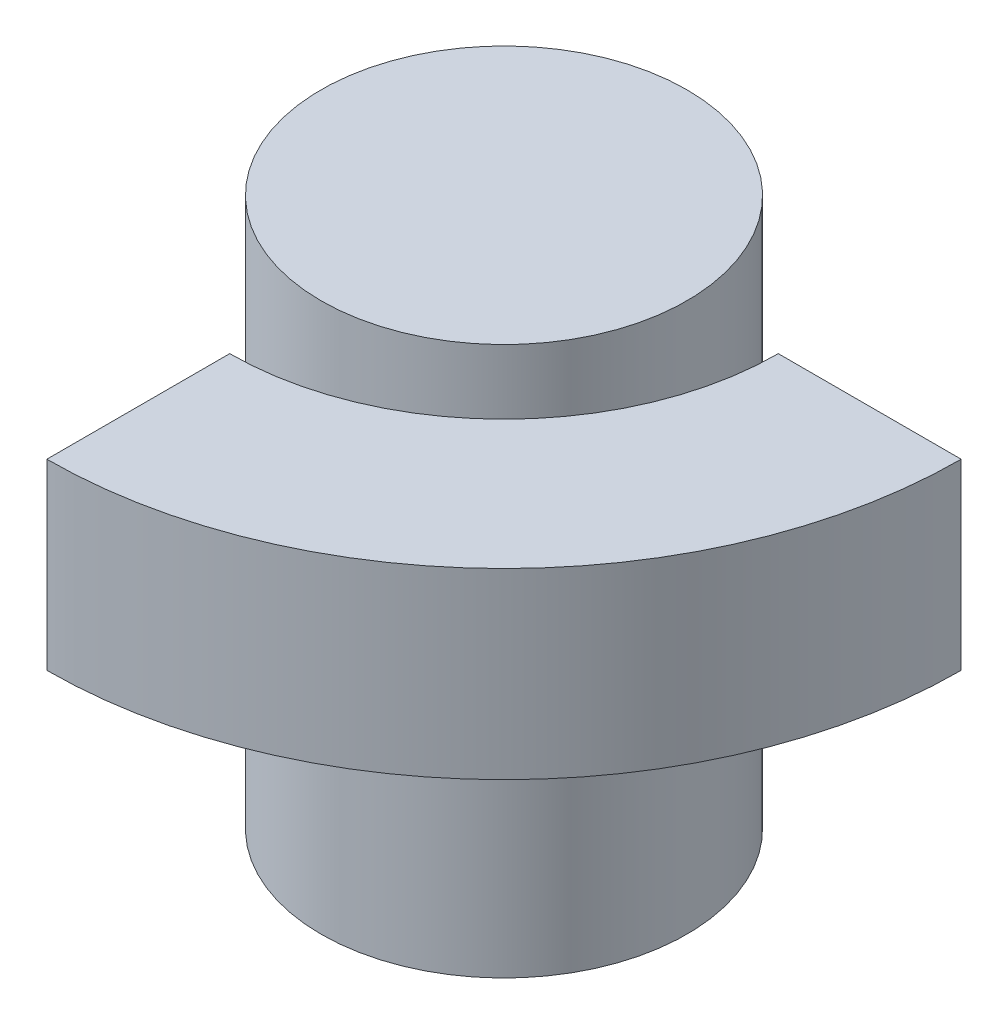
ISO-10303-21;
HEADER;
FILE_DESCRIPTION(('STEP AP214'),'2;1');
FILE_NAME('part.step','',(''),(''),'','','');
FILE_SCHEMA(('AUTOMOTIVE_DESIGN { 1 0 10303 214 1 1 1 1 }'));
ENDSEC;
DATA;
#1=APPLICATION_CONTEXT('core data for automotive mechanical design processes');
#2=APPLICATION_PROTOCOL_DEFINITION('international standard','automotive_design',2000,#1);
#3=PRODUCT_CONTEXT('',#1,'mechanical');
#4=PRODUCT('Part','Part','',(#3));
#5=PRODUCT_RELATED_PRODUCT_CATEGORY('part','',(#4));
#6=PRODUCT_DEFINITION_FORMATION('','',#4);
#7=PRODUCT_DEFINITION_CONTEXT('part definition',#1,'design');
#8=PRODUCT_DEFINITION('design','',#6,#7);
#9=PRODUCT_DEFINITION_SHAPE('','',#8);
#10=(LENGTH_UNIT() NAMED_UNIT(*) SI_UNIT(.MILLI.,.METRE.));
#11=(NAMED_UNIT(*) PLANE_ANGLE_UNIT() SI_UNIT($,.RADIAN.));
#12=(NAMED_UNIT(*) SI_UNIT($,.STERADIAN.) SOLID_ANGLE_UNIT());
#13=UNCERTAINTY_MEASURE_WITH_UNIT(LENGTH_MEASURE(1.E-05),#10,'distance_accuracy_value','');
#14=(GEOMETRIC_REPRESENTATION_CONTEXT(3) GLOBAL_UNCERTAINTY_ASSIGNED_CONTEXT((#13)) GLOBAL_UNIT_ASSIGNED_CONTEXT((#10,
#11,#12)) REPRESENTATION_CONTEXT('',''));
#15=CARTESIAN_POINT('',(0.,0.,0.));
#16=DIRECTION('',(0.,0.,1.));
#17=DIRECTION('',(1.,0.,0.));
#18=AXIS2_PLACEMENT_3D('',#15,#16,#17);
#19=CARTESIAN_POINT('',(20.,-15.,0.));
#20=DIRECTION('',(0.,1.,0.));
#21=DIRECTION('',(0.,0.,1.));
#22=AXIS2_PLACEMENT_3D('',#19,#20,#21);
#23=CYLINDRICAL_SURFACE('',#22,15.);
#24=CARTESIAN_POINT('',(20.,15.,0.));
#25=DIRECTION('',(0.,1.,0.));
#26=DIRECTION('',(0.,0.,1.));
#27=AXIS2_PLACEMENT_3D('',#24,#25,#26);
#28=CIRCLE('',#27,15.);
#29=CARTESIAN_POINT('',(20.,15.,15.));
#30=VERTEX_POINT('',#29);
#31=CARTESIAN_POINT('',(35.,15.,0.));
#32=VERTEX_POINT('',#31);
#33=EDGE_CURVE('E12',#30,#32,#28,.T.);
#34=ORIENTED_EDGE('',*,*,#33,.T.);
#35=DIRECTION('',(0.,-1.,0.));
#36=VECTOR('',#35,1.);
#37=CARTESIAN_POINT('',(35.,5.,0.));
#38=LINE('',#37,#36);
#39=CARTESIAN_POINT('',(35.,5.,0.));
#40=VERTEX_POINT('',#39);
#41=EDGE_CURVE('E101',#32,#40,#38,.T.);
#42=ORIENTED_EDGE('',*,*,#41,.T.);
#43=CARTESIAN_POINT('',(20.,5.,0.));
#44=DIRECTION('',(0.,1.,0.));
#45=DIRECTION('',(0.,0.,1.));
#46=AXIS2_PLACEMENT_3D('',#43,#44,#45);
#47=CIRCLE('',#46,15.);
#48=CARTESIAN_POINT('',(20.,5.,15.));
#49=VERTEX_POINT('',#48);
#50=EDGE_CURVE('E83',#49,#40,#47,.T.);
#51=ORIENTED_EDGE('',*,*,#50,.F.);
#52=DIRECTION('',(0.,-1.,0.));
#53=VECTOR('',#52,1.);
#54=CARTESIAN_POINT('',(20.,5.,15.));
#55=LINE('',#54,#53);
#56=EDGE_CURVE('E109',#30,#49,#55,.T.);
#57=ORIENTED_EDGE('',*,*,#56,.F.);
#58=EDGE_LOOP('',(#34,#42,#51,#57));
#59=FACE_BOUND('',#58,.T.);
#60=ADVANCED_FACE('F43',(#59),#23,.F.);
#61=CARTESIAN_POINT('',(20.,15.,15.));
#62=DIRECTION('',(0.,-1.,0.));
#63=DIRECTION('',(0.,0.,-1.));
#64=AXIS2_PLACEMENT_3D('',#61,#62,#63);
#65=PLANE('',#64);
#66=CARTESIAN_POINT('',(20.,15.,0.));
#67=DIRECTION('',(0.,1.,0.));
#68=DIRECTION('',(0.,0.,1.));
#69=AXIS2_PLACEMENT_3D('',#66,#67,#68);
#70=CIRCLE('',#69,25.);
#71=CARTESIAN_POINT('',(20.,15.,25.));
#72=VERTEX_POINT('',#71);
#73=CARTESIAN_POINT('',(45.,15.,0.));
#74=VERTEX_POINT('',#73);
#75=EDGE_CURVE('E51',#72,#74,#70,.T.);
#76=ORIENTED_EDGE('',*,*,#75,.T.);
#77=DIRECTION('',(-1.,0.,0.));
#78=VECTOR('',#77,1.);
#79=CARTESIAN_POINT('',(35.,15.,0.));
#80=LINE('',#79,#78);
#81=EDGE_CURVE('E107',#74,#32,#80,.T.);
#82=ORIENTED_EDGE('',*,*,#81,.T.);
#83=ORIENTED_EDGE('',*,*,#33,.F.);
#84=DIRECTION('',(0.,0.,-1.));
#85=VECTOR('',#84,1.);
#86=CARTESIAN_POINT('',(20.,15.,15.));
#87=LINE('',#86,#85);
#88=EDGE_CURVE('E95',#72,#30,#87,.T.);
#89=ORIENTED_EDGE('',*,*,#88,.F.);
#90=EDGE_LOOP('',(#76,#82,#83,#89));
#91=FACE_BOUND('',#90,.T.);
#92=ADVANCED_FACE('F45',(#91),#65,.F.);
#93=CARTESIAN_POINT('',(20.,-15.,0.));
#94=DIRECTION('',(0.,1.,0.));
#95=DIRECTION('',(0.,0.,1.));
#96=AXIS2_PLACEMENT_3D('',#93,#94,#95);
#97=CYLINDRICAL_SURFACE('',#96,25.);
#98=CARTESIAN_POINT('',(20.,5.,0.));
#99=DIRECTION('',(0.,1.,0.));
#100=DIRECTION('',(0.,0.,1.));
#101=AXIS2_PLACEMENT_3D('',#98,#99,#100);
#102=CIRCLE('',#101,25.);
#103=CARTESIAN_POINT('',(20.,5.,25.));
#104=VERTEX_POINT('',#103);
#105=CARTESIAN_POINT('',(45.,5.,0.));
#106=VERTEX_POINT('',#105);
#107=EDGE_CURVE('E94',#104,#106,#102,.T.);
#108=ORIENTED_EDGE('',*,*,#107,.T.);
#109=DIRECTION('',(0.,1.,0.));
#110=VECTOR('',#109,1.);
#111=CARTESIAN_POINT('',(45.,5.,0.));
#112=LINE('',#111,#110);
#113=EDGE_CURVE('E102',#106,#74,#112,.T.);
#114=ORIENTED_EDGE('',*,*,#113,.T.);
#115=ORIENTED_EDGE('',*,*,#75,.F.);
#116=DIRECTION('',(0.,1.,0.));
#117=VECTOR('',#116,1.);
#118=CARTESIAN_POINT('',(20.,5.,25.));
#119=LINE('',#118,#117);
#120=EDGE_CURVE('E112',#104,#72,#119,.T.);
#121=ORIENTED_EDGE('',*,*,#120,.F.);
#122=EDGE_LOOP('',(#108,#114,#115,#121));
#123=FACE_BOUND('',#122,.T.);
#124=ADVANCED_FACE('F115',(#123),#97,.T.);
#125=CARTESIAN_POINT('',(20.,5.,15.));
#126=DIRECTION('',(0.,1.,0.));
#127=DIRECTION('',(0.,0.,1.));
#128=AXIS2_PLACEMENT_3D('',#125,#126,#127);
#129=PLANE('',#128);
#130=DIRECTION('',(0.,0.,1.));
#131=VECTOR('',#130,1.);
#132=CARTESIAN_POINT('',(20.,5.,15.));
#133=LINE('',#132,#131);
#134=EDGE_CURVE('E89',#49,#104,#133,.T.);
#135=ORIENTED_EDGE('',*,*,#134,.F.);
#136=ORIENTED_EDGE('',*,*,#50,.T.);
#137=DIRECTION('',(1.,0.,0.));
#138=VECTOR('',#137,1.);
#139=CARTESIAN_POINT('',(35.,5.,0.));
#140=LINE('',#139,#138);
#141=EDGE_CURVE('E86',#40,#106,#140,.T.);
#142=ORIENTED_EDGE('',*,*,#141,.T.);
#143=ORIENTED_EDGE('',*,*,#107,.F.);
#144=EDGE_LOOP('',(#135,#136,#142,#143));
#145=FACE_BOUND('',#144,.T.);
#146=ADVANCED_FACE('F85',(#145),#129,.F.);
#147=CARTESIAN_POINT('',(20.,0.,-20.));
#148=DIRECTION('',(1.,0.,0.));
#149=DIRECTION('',(0.,0.,-1.));
#150=AXIS2_PLACEMENT_3D('',#147,#148,#149);
#151=PLANE('',#150);
#152=ORIENTED_EDGE('',*,*,#56,.T.);
#153=ORIENTED_EDGE('',*,*,#134,.T.);
#154=ORIENTED_EDGE('',*,*,#120,.T.);
#155=ORIENTED_EDGE('',*,*,#88,.T.);
#156=EDGE_LOOP('',(#152,#153,#154,#155));
#157=FACE_BOUND('',#156,.T.);
#158=ADVANCED_FACE('F117',(#157),#151,.F.);
#159=CARTESIAN_POINT('',(0.,0.,0.));
#160=DIRECTION('',(0.,0.,-1.));
#161=DIRECTION('',(-1.,0.,0.));
#162=AXIS2_PLACEMENT_3D('',#159,#160,#161);
#163=PLANE('',#162);
#164=ORIENTED_EDGE('',*,*,#41,.F.);
#165=ORIENTED_EDGE('',*,*,#81,.F.);
#166=ORIENTED_EDGE('',*,*,#113,.F.);
#167=ORIENTED_EDGE('',*,*,#141,.F.);
#168=EDGE_LOOP('',(#164,#165,#166,#167));
#169=FACE_BOUND('',#168,.T.);
#170=ADVANCED_FACE('F99',(#169),#163,.T.);
#171=CLOSED_SHELL('',(#60,#92,#124,#146,#158,#170));
#172=MANIFOLD_SOLID_BREP('B2',#171);
#173=CARTESIAN_POINT('',(20.,-15.,0.));
#174=DIRECTION('',(0.,1.,0.));
#175=DIRECTION('',(0.,0.,1.));
#176=AXIS2_PLACEMENT_3D('',#173,#174,#175);
#177=CYLINDRICAL_SURFACE('',#176,10.);
#178=CARTESIAN_POINT('',(20.,-15.,0.));
#179=DIRECTION('',(0.,1.,0.));
#180=DIRECTION('',(0.,0.,1.));
#181=AXIS2_PLACEMENT_3D('',#178,#179,#180);
#182=CIRCLE('',#181,10.);
#183=CARTESIAN_POINT('',(20.,-15.,10.));
#184=VERTEX_POINT('',#183);
#185=EDGE_CURVE('E42',#184,#184,#182,.T.);
#186=ORIENTED_EDGE('',*,*,#185,.T.);
#187=EDGE_LOOP('',(#186));
#188=FACE_BOUND('',#187,.T.);
#189=CARTESIAN_POINT('',(20.,15.,0.));
#190=DIRECTION('',(0.,1.,0.));
#191=DIRECTION('',(0.,0.,1.));
#192=AXIS2_PLACEMENT_3D('',#189,#190,#191);
#193=CIRCLE('',#192,10.);
#194=CARTESIAN_POINT('',(20.,15.,10.));
#195=VERTEX_POINT('',#194);
#196=EDGE_CURVE('E173',#195,#195,#193,.T.);
#197=ORIENTED_EDGE('',*,*,#196,.F.);
#198=EDGE_LOOP('',(#197));
#199=FACE_BOUND('',#198,.T.);
#200=ADVANCED_FACE('F167',(#188,#199),#177,.T.);
#201=CARTESIAN_POINT('',(20.,-15.,0.));
#202=DIRECTION('',(0.,1.,0.));
#203=DIRECTION('',(0.,0.,1.));
#204=AXIS2_PLACEMENT_3D('',#201,#202,#203);
#205=PLANE('',#204);
#206=ORIENTED_EDGE('',*,*,#185,.F.);
#207=EDGE_LOOP('',(#206));
#208=FACE_BOUND('',#207,.T.);
#209=ADVANCED_FACE('F182',(#208),#205,.F.);
#210=CARTESIAN_POINT('',(20.,15.,0.));
#211=DIRECTION('',(0.,1.,0.));
#212=DIRECTION('',(0.,0.,1.));
#213=AXIS2_PLACEMENT_3D('',#210,#211,#212);
#214=PLANE('',#213);
#215=ORIENTED_EDGE('',*,*,#196,.T.);
#216=EDGE_LOOP('',(#215));
#217=FACE_BOUND('',#216,.T.);
#218=ADVANCED_FACE('F179',(#217),#214,.T.);
#219=CLOSED_SHELL('',(#200,#209,#218));
#220=MANIFOLD_SOLID_BREP('B6',#219);
#221=ADVANCED_BREP_SHAPE_REPRESENTATION('',(#18,#172,#220),#14);
#222=SHAPE_DEFINITION_REPRESENTATION(#9,#221);
ENDSEC;
END-ISO-10303-21;
